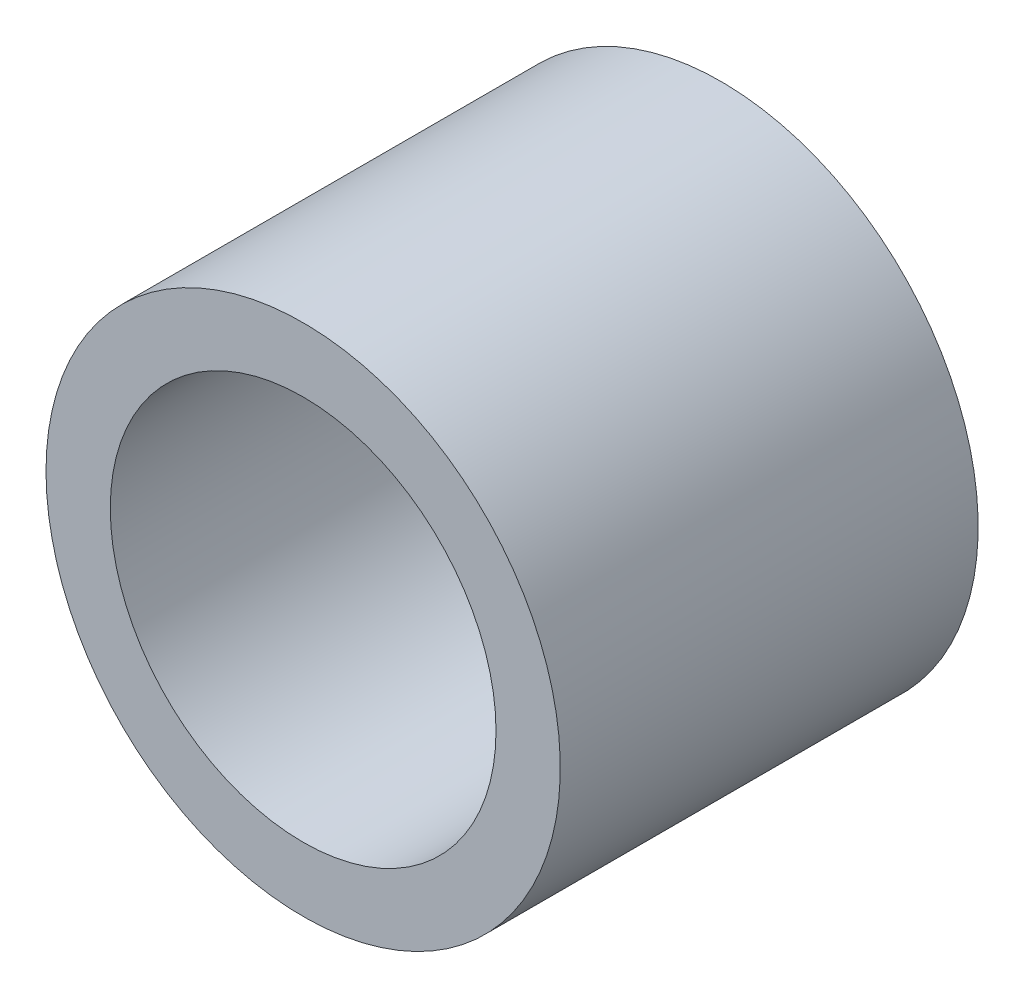
ISO-10303-21;
HEADER;
FILE_DESCRIPTION(('STEP AP214'),'2;1');
FILE_NAME('part.step','',(''),(''),'','','');
FILE_SCHEMA(('AUTOMOTIVE_DESIGN { 1 0 10303 214 1 1 1 1 }'));
ENDSEC;
DATA;
#1=APPLICATION_CONTEXT('core data for automotive mechanical design processes');
#2=APPLICATION_PROTOCOL_DEFINITION('international standard','automotive_design',2000,#1);
#3=PRODUCT_CONTEXT('',#1,'mechanical');
#4=PRODUCT('Part','Part','',(#3));
#5=PRODUCT_RELATED_PRODUCT_CATEGORY('part','',(#4));
#6=PRODUCT_DEFINITION_FORMATION('','',#4);
#7=PRODUCT_DEFINITION_CONTEXT('part definition',#1,'design');
#8=PRODUCT_DEFINITION('design','',#6,#7);
#9=PRODUCT_DEFINITION_SHAPE('','',#8);
#10=(LENGTH_UNIT() NAMED_UNIT(*) SI_UNIT(.MILLI.,.METRE.));
#11=(NAMED_UNIT(*) PLANE_ANGLE_UNIT() SI_UNIT($,.RADIAN.));
#12=(NAMED_UNIT(*) SI_UNIT($,.STERADIAN.) SOLID_ANGLE_UNIT());
#13=UNCERTAINTY_MEASURE_WITH_UNIT(LENGTH_MEASURE(1.E-05),#10,'distance_accuracy_value','');
#14=(GEOMETRIC_REPRESENTATION_CONTEXT(3) GLOBAL_UNCERTAINTY_ASSIGNED_CONTEXT((#13)) GLOBAL_UNIT_ASSIGNED_CONTEXT((#10,
#11,#12)) REPRESENTATION_CONTEXT('',''));
#15=CARTESIAN_POINT('',(0.,0.,0.));
#16=DIRECTION('',(0.,0.,1.));
#17=DIRECTION('',(1.,0.,0.));
#18=AXIS2_PLACEMENT_3D('',#15,#16,#17);
#19=CARTESIAN_POINT('',(0.,0.,26.));
#20=DIRECTION('',(0.,0.,1.));
#21=DIRECTION('',(1.,0.,0.));
#22=AXIS2_PLACEMENT_3D('',#19,#20,#21);
#23=PLANE('',#22);
#24=CARTESIAN_POINT('',(0.,0.,26.));
#25=DIRECTION('',(0.,0.,1.));
#26=DIRECTION('',(1.,0.,0.));
#27=AXIS2_PLACEMENT_3D('',#24,#25,#26);
#28=CIRCLE('',#27,16.);
#29=CARTESIAN_POINT('',(-16.,0.,26.));
#30=VERTEX_POINT('',#29);
#31=EDGE_CURVE('E10',#30,#30,#28,.T.);
#32=ORIENTED_EDGE('',*,*,#31,.T.);
#33=EDGE_LOOP('',(#32));
#34=FACE_BOUND('',#33,.T.);
#35=CARTESIAN_POINT('',(0.,0.,26.));
#36=DIRECTION('',(0.,0.,1.));
#37=DIRECTION('',(1.,0.,0.));
#38=AXIS2_PLACEMENT_3D('',#35,#36,#37);
#39=CIRCLE('',#38,12.);
#40=CARTESIAN_POINT('',(-12.,0.,26.));
#41=VERTEX_POINT('',#40);
#42=EDGE_CURVE('E42',#41,#41,#39,.T.);
#43=ORIENTED_EDGE('',*,*,#42,.F.);
#44=EDGE_LOOP('',(#43));
#45=FACE_BOUND('',#44,.T.);
#46=ADVANCED_FACE('F31',(#34,#45),#23,.T.);
#47=CARTESIAN_POINT('',(0.,0.,0.));
#48=DIRECTION('',(0.,0.,1.));
#49=DIRECTION('',(1.,0.,0.));
#50=AXIS2_PLACEMENT_3D('',#47,#48,#49);
#51=PLANE('',#50);
#52=CARTESIAN_POINT('',(0.,0.,0.));
#53=DIRECTION('',(0.,0.,1.));
#54=DIRECTION('',(1.,0.,0.));
#55=AXIS2_PLACEMENT_3D('',#52,#53,#54);
#56=CIRCLE('',#55,16.);
#57=CARTESIAN_POINT('',(-16.,0.,0.));
#58=VERTEX_POINT('',#57);
#59=EDGE_CURVE('E35',#58,#58,#56,.T.);
#60=ORIENTED_EDGE('',*,*,#59,.F.);
#61=EDGE_LOOP('',(#60));
#62=FACE_BOUND('',#61,.T.);
#63=CARTESIAN_POINT('',(0.,0.,0.));
#64=DIRECTION('',(0.,0.,1.));
#65=DIRECTION('',(1.,0.,0.));
#66=AXIS2_PLACEMENT_3D('',#63,#64,#65);
#67=CIRCLE('',#66,12.);
#68=CARTESIAN_POINT('',(-12.,0.,0.));
#69=VERTEX_POINT('',#68);
#70=EDGE_CURVE('E44',#69,#69,#67,.T.);
#71=ORIENTED_EDGE('',*,*,#70,.T.);
#72=EDGE_LOOP('',(#71));
#73=FACE_BOUND('',#72,.T.);
#74=ADVANCED_FACE('F54',(#62,#73),#51,.F.);
#75=CARTESIAN_POINT('',(0.,0.,26.));
#76=DIRECTION('',(0.,0.,-1.));
#77=DIRECTION('',(-1.,0.,0.));
#78=AXIS2_PLACEMENT_3D('',#75,#76,#77);
#79=CYLINDRICAL_SURFACE('',#78,16.);
#80=CARTESIAN_POINT('',(-16.,0.,26.));
#81=CARTESIAN_POINT('',(-16.,0.,25.7291666666667));
#82=CARTESIAN_POINT('',(-16.,0.,25.4583333333333));
#83=CARTESIAN_POINT('',(-16.,0.,24.9166666666667));
#84=CARTESIAN_POINT('',(-16.,0.,24.6458333333333));
#85=CARTESIAN_POINT('',(-16.,0.,24.1041666666667));
#86=CARTESIAN_POINT('',(-16.,0.,23.8333333333333));
#87=CARTESIAN_POINT('',(-16.,0.,23.2916666666667));
#88=CARTESIAN_POINT('',(-16.,0.,23.0208333333333));
#89=CARTESIAN_POINT('',(-16.,0.,22.4791666666667));
#90=CARTESIAN_POINT('',(-16.,0.,22.2083333333333));
#91=CARTESIAN_POINT('',(-16.,0.,21.6666666666667));
#92=CARTESIAN_POINT('',(-16.,0.,21.3958333333333));
#93=CARTESIAN_POINT('',(-16.,0.,20.8541666666667));
#94=CARTESIAN_POINT('',(-16.,0.,20.5833333333333));
#95=CARTESIAN_POINT('',(-16.,0.,20.0416666666667));
#96=CARTESIAN_POINT('',(-16.,0.,19.7708333333333));
#97=CARTESIAN_POINT('',(-16.,0.,19.2291666666667));
#98=CARTESIAN_POINT('',(-16.,0.,18.9583333333333));
#99=CARTESIAN_POINT('',(-16.,0.,18.4166666666667));
#100=CARTESIAN_POINT('',(-16.,0.,18.1458333333333));
#101=CARTESIAN_POINT('',(-16.,0.,17.6041666666667));
#102=CARTESIAN_POINT('',(-16.,0.,17.3333333333333));
#103=CARTESIAN_POINT('',(-16.,0.,16.7916666666667));
#104=CARTESIAN_POINT('',(-16.,0.,16.5208333333333));
#105=CARTESIAN_POINT('',(-16.,0.,15.9791666666667));
#106=CARTESIAN_POINT('',(-16.,0.,15.7083333333333));
#107=CARTESIAN_POINT('',(-16.,0.,15.1666666666667));
#108=CARTESIAN_POINT('',(-16.,0.,14.8958333333333));
#109=CARTESIAN_POINT('',(-16.,0.,14.3541666666667));
#110=CARTESIAN_POINT('',(-16.,0.,14.0833333333333));
#111=CARTESIAN_POINT('',(-16.,0.,13.5416666666667));
#112=CARTESIAN_POINT('',(-16.,0.,13.2708333333333));
#113=CARTESIAN_POINT('',(-16.,0.,12.7291666666667));
#114=CARTESIAN_POINT('',(-16.,0.,12.4583333333333));
#115=CARTESIAN_POINT('',(-16.,0.,11.9166666666667));
#116=CARTESIAN_POINT('',(-16.,0.,11.6458333333333));
#117=CARTESIAN_POINT('',(-16.,0.,11.1041666666667));
#118=CARTESIAN_POINT('',(-16.,0.,10.8333333333333));
#119=CARTESIAN_POINT('',(-16.,0.,10.2916666666667));
#120=CARTESIAN_POINT('',(-16.,0.,10.0208333333333));
#121=CARTESIAN_POINT('',(-16.,0.,9.47916666666667));
#122=CARTESIAN_POINT('',(-16.,0.,9.20833333333333));
#123=CARTESIAN_POINT('',(-16.,0.,8.66666666666667));
#124=CARTESIAN_POINT('',(-16.,0.,8.39583333333333));
#125=CARTESIAN_POINT('',(-16.,0.,7.85416666666667));
#126=CARTESIAN_POINT('',(-16.,0.,7.58333333333333));
#127=CARTESIAN_POINT('',(-16.,0.,7.04166666666667));
#128=CARTESIAN_POINT('',(-16.,0.,6.77083333333333));
#129=CARTESIAN_POINT('',(-16.,0.,6.22916666666667));
#130=CARTESIAN_POINT('',(-16.,0.,5.95833333333333));
#131=CARTESIAN_POINT('',(-16.,0.,5.41666666666667));
#132=CARTESIAN_POINT('',(-16.,0.,5.14583333333333));
#133=CARTESIAN_POINT('',(-16.,0.,4.60416666666667));
#134=CARTESIAN_POINT('',(-16.,0.,4.33333333333333));
#135=CARTESIAN_POINT('',(-16.,0.,3.79166666666667));
#136=CARTESIAN_POINT('',(-16.,0.,3.52083333333333));
#137=CARTESIAN_POINT('',(-16.,0.,2.97916666666667));
#138=CARTESIAN_POINT('',(-16.,0.,2.70833333333333));
#139=CARTESIAN_POINT('',(-16.,0.,2.16666666666667));
#140=CARTESIAN_POINT('',(-16.,0.,1.89583333333333));
#141=CARTESIAN_POINT('',(-16.,0.,1.35416666666667));
#142=CARTESIAN_POINT('',(-16.,0.,1.08333333333333));
#143=CARTESIAN_POINT('',(-16.,0.,0.541666666666667));
#144=CARTESIAN_POINT('',(-16.,0.,0.270833333333334));
#145=CARTESIAN_POINT('',(-16.,0.,0.));
#146=B_SPLINE_CURVE_WITH_KNOTS('',3,(#80,#81,#82,#83,#84,#85,#86,#87,#88,#89,#90,#91,#92,#93,
#94,#95,#96,#97,#98,#99,#100,#101,#102,#103,#104,#105,#106,#107,#108,#109,#110,#111,#112,#113,
#114,#115,#116,#117,#118,#119,#120,#121,#122,#123,#124,#125,#126,#127,#128,#129,#130,#131,#132,
#133,#134,#135,#136,#137,#138,#139,#140,#141,#142,#143,#144,#145),.UNSPECIFIED.,.F.,.F.,(4,2,2,
2,2,2,2,2,2,2,2,2,2,2,2,2,2,2,2,2,2,2,2,2,2,2,2,2,2,2,2,2,4),(0.,0.812500000000001,1.625,2.4375,
3.25,4.0625,4.875,5.6875,6.5,7.3125,8.125,8.9375,9.75,10.5625,11.375,12.1875,13.,13.8125,14.625,
15.4375,16.25,17.0625,17.875,18.6875,19.5,20.3125,21.125,21.9375,22.75,23.5625,24.375,25.1875,
26.),.UNSPECIFIED.);
#147=EDGE_CURVE('BSEAM33',#30,#58,#146,.T.);
#148=ORIENTED_EDGE('',*,*,#31,.F.);
#149=ORIENTED_EDGE('',*,*,#59,.T.);
#150=ORIENTED_EDGE('',*,*,#147,.T.);
#151=ORIENTED_EDGE('',*,*,#147,.F.);
#152=EDGE_LOOP('',(#148,#150,#149,#151));
#153=FACE_BOUND('',#152,.T.);
#154=ADVANCED_FACE('F33',(#153),#79,.T.);
#155=CARTESIAN_POINT('',(0.,0.,26.));
#156=DIRECTION('',(0.,0.,-1.));
#157=DIRECTION('',(-1.,0.,0.));
#158=AXIS2_PLACEMENT_3D('',#155,#156,#157);
#159=CYLINDRICAL_SURFACE('',#158,12.);
#160=CARTESIAN_POINT('',(-12.,0.,26.));
#161=CARTESIAN_POINT('',(-12.,0.,25.7291666666667));
#162=CARTESIAN_POINT('',(-12.,0.,25.4583333333333));
#163=CARTESIAN_POINT('',(-12.,0.,24.9166666666667));
#164=CARTESIAN_POINT('',(-12.,0.,24.6458333333333));
#165=CARTESIAN_POINT('',(-12.,0.,24.1041666666667));
#166=CARTESIAN_POINT('',(-12.,0.,23.8333333333333));
#167=CARTESIAN_POINT('',(-12.,0.,23.2916666666667));
#168=CARTESIAN_POINT('',(-12.,0.,23.0208333333333));
#169=CARTESIAN_POINT('',(-12.,0.,22.4791666666667));
#170=CARTESIAN_POINT('',(-12.,0.,22.2083333333333));
#171=CARTESIAN_POINT('',(-12.,0.,21.6666666666667));
#172=CARTESIAN_POINT('',(-12.,0.,21.3958333333333));
#173=CARTESIAN_POINT('',(-12.,0.,20.8541666666667));
#174=CARTESIAN_POINT('',(-12.,0.,20.5833333333333));
#175=CARTESIAN_POINT('',(-12.,0.,20.0416666666667));
#176=CARTESIAN_POINT('',(-12.,0.,19.7708333333333));
#177=CARTESIAN_POINT('',(-12.,0.,19.2291666666667));
#178=CARTESIAN_POINT('',(-12.,0.,18.9583333333333));
#179=CARTESIAN_POINT('',(-12.,0.,18.4166666666667));
#180=CARTESIAN_POINT('',(-12.,0.,18.1458333333333));
#181=CARTESIAN_POINT('',(-12.,0.,17.6041666666667));
#182=CARTESIAN_POINT('',(-12.,0.,17.3333333333333));
#183=CARTESIAN_POINT('',(-12.,0.,16.7916666666667));
#184=CARTESIAN_POINT('',(-12.,0.,16.5208333333333));
#185=CARTESIAN_POINT('',(-12.,0.,15.9791666666667));
#186=CARTESIAN_POINT('',(-12.,0.,15.7083333333333));
#187=CARTESIAN_POINT('',(-12.,0.,15.1666666666667));
#188=CARTESIAN_POINT('',(-12.,0.,14.8958333333333));
#189=CARTESIAN_POINT('',(-12.,0.,14.3541666666667));
#190=CARTESIAN_POINT('',(-12.,0.,14.0833333333333));
#191=CARTESIAN_POINT('',(-12.,0.,13.5416666666667));
#192=CARTESIAN_POINT('',(-12.,0.,13.2708333333333));
#193=CARTESIAN_POINT('',(-12.,0.,12.7291666666667));
#194=CARTESIAN_POINT('',(-12.,0.,12.4583333333333));
#195=CARTESIAN_POINT('',(-12.,0.,11.9166666666667));
#196=CARTESIAN_POINT('',(-12.,0.,11.6458333333333));
#197=CARTESIAN_POINT('',(-12.,0.,11.1041666666667));
#198=CARTESIAN_POINT('',(-12.,0.,10.8333333333333));
#199=CARTESIAN_POINT('',(-12.,0.,10.2916666666667));
#200=CARTESIAN_POINT('',(-12.,0.,10.0208333333333));
#201=CARTESIAN_POINT('',(-12.,0.,9.47916666666667));
#202=CARTESIAN_POINT('',(-12.,0.,9.20833333333333));
#203=CARTESIAN_POINT('',(-12.,0.,8.66666666666667));
#204=CARTESIAN_POINT('',(-12.,0.,8.39583333333333));
#205=CARTESIAN_POINT('',(-12.,0.,7.85416666666667));
#206=CARTESIAN_POINT('',(-12.,0.,7.58333333333333));
#207=CARTESIAN_POINT('',(-12.,0.,7.04166666666667));
#208=CARTESIAN_POINT('',(-12.,0.,6.77083333333333));
#209=CARTESIAN_POINT('',(-12.,0.,6.22916666666667));
#210=CARTESIAN_POINT('',(-12.,0.,5.95833333333333));
#211=CARTESIAN_POINT('',(-12.,0.,5.41666666666667));
#212=CARTESIAN_POINT('',(-12.,0.,5.14583333333333));
#213=CARTESIAN_POINT('',(-12.,0.,4.60416666666667));
#214=CARTESIAN_POINT('',(-12.,0.,4.33333333333333));
#215=CARTESIAN_POINT('',(-12.,0.,3.79166666666667));
#216=CARTESIAN_POINT('',(-12.,0.,3.52083333333333));
#217=CARTESIAN_POINT('',(-12.,0.,2.97916666666667));
#218=CARTESIAN_POINT('',(-12.,0.,2.70833333333333));
#219=CARTESIAN_POINT('',(-12.,0.,2.16666666666667));
#220=CARTESIAN_POINT('',(-12.,0.,1.89583333333333));
#221=CARTESIAN_POINT('',(-12.,0.,1.35416666666667));
#222=CARTESIAN_POINT('',(-12.,0.,1.08333333333333));
#223=CARTESIAN_POINT('',(-12.,0.,0.541666666666667));
#224=CARTESIAN_POINT('',(-12.,0.,0.270833333333334));
#225=CARTESIAN_POINT('',(-12.,0.,0.));
#226=B_SPLINE_CURVE_WITH_KNOTS('',3,(#160,#161,#162,#163,#164,#165,#166,#167,#168,#169,#170,
#171,#172,#173,#174,#175,#176,#177,#178,#179,#180,#181,#182,#183,#184,#185,#186,#187,#188,#189,
#190,#191,#192,#193,#194,#195,#196,#197,#198,#199,#200,#201,#202,#203,#204,#205,#206,#207,#208,
#209,#210,#211,#212,#213,#214,#215,#216,#217,#218,#219,#220,#221,#222,#223,#224,#225),
.UNSPECIFIED.,.F.,.F.,(4,2,2,2,2,2,2,2,2,2,2,2,2,2,2,2,2,2,2,2,2,2,2,2,2,2,2,2,2,2,2,2,4),(0.,
0.812500000000001,1.625,2.4375,3.25,4.0625,4.875,5.6875,6.5,7.3125,8.125,8.9375,9.75,10.5625,
11.375,12.1875,13.,13.8125,14.625,15.4375,16.25,17.0625,17.875,18.6875,19.5,20.3125,21.125,
21.9375,22.75,23.5625,24.375,25.1875,26.),.UNSPECIFIED.);
#227=EDGE_CURVE('BSEAM50',#41,#69,#226,.T.);
#228=ORIENTED_EDGE('',*,*,#42,.T.);
#229=ORIENTED_EDGE('',*,*,#70,.F.);
#230=ORIENTED_EDGE('',*,*,#227,.T.);
#231=ORIENTED_EDGE('',*,*,#227,.F.);
#232=EDGE_LOOP('',(#228,#230,#229,#231));
#233=FACE_BOUND('',#232,.T.);
#234=ADVANCED_FACE('F50',(#233),#159,.F.);
#235=CLOSED_SHELL('',(#46,#74,#154,#234));
#236=MANIFOLD_SOLID_BREP('B2',#235);
#237=ADVANCED_BREP_SHAPE_REPRESENTATION('',(#18,#236),#14);
#238=SHAPE_DEFINITION_REPRESENTATION(#9,#237);
ENDSEC;
END-ISO-10303-21;
